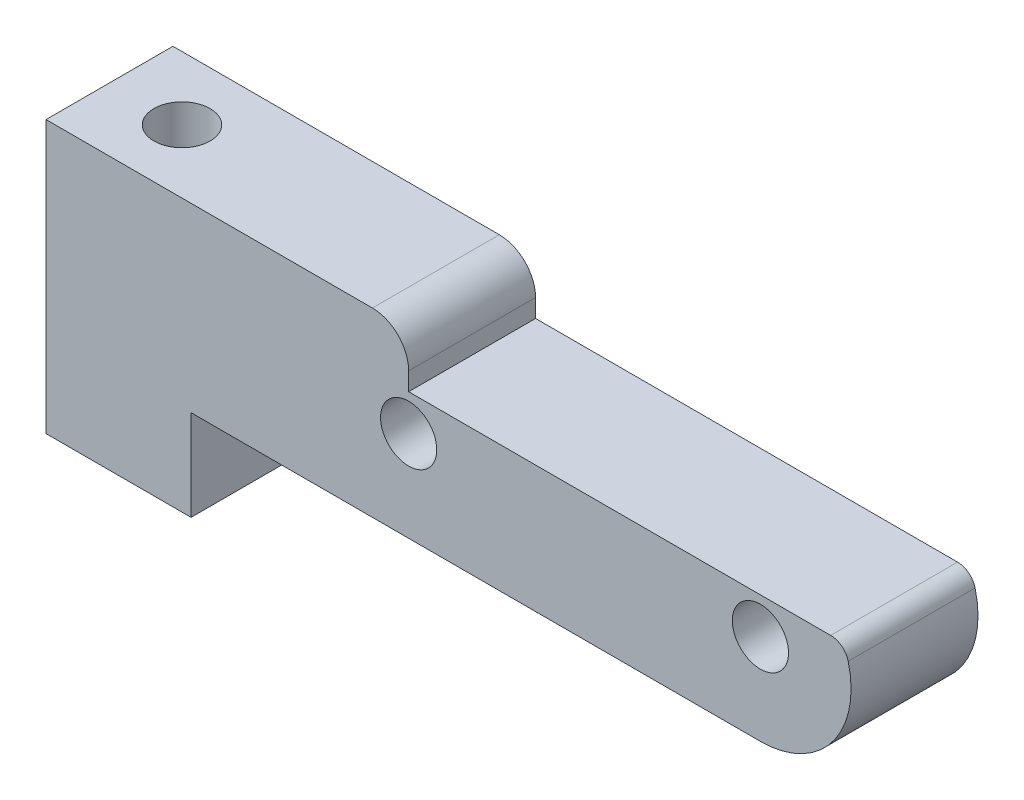
ISO-10303-21;
HEADER;
FILE_DESCRIPTION(('STEP AP214'),'2;1');
FILE_NAME('part.step','',(''),(''),'','','');
FILE_SCHEMA(('AUTOMOTIVE_DESIGN { 1 0 10303 214 1 1 1 1 }'));
ENDSEC;
DATA;
#1=APPLICATION_CONTEXT('core data for automotive mechanical design processes');
#2=APPLICATION_PROTOCOL_DEFINITION('international standard','automotive_design',2000,#1);
#3=PRODUCT_CONTEXT('',#1,'mechanical');
#4=PRODUCT('Part','Part','',(#3));
#5=PRODUCT_RELATED_PRODUCT_CATEGORY('part','',(#4));
#6=PRODUCT_DEFINITION_FORMATION('','',#4);
#7=PRODUCT_DEFINITION_CONTEXT('part definition',#1,'design');
#8=PRODUCT_DEFINITION('design','',#6,#7);
#9=PRODUCT_DEFINITION_SHAPE('','',#8);
#10=(LENGTH_UNIT() NAMED_UNIT(*) SI_UNIT(.MILLI.,.METRE.));
#11=(NAMED_UNIT(*) PLANE_ANGLE_UNIT() SI_UNIT($,.RADIAN.));
#12=(NAMED_UNIT(*) SI_UNIT($,.STERADIAN.) SOLID_ANGLE_UNIT());
#13=UNCERTAINTY_MEASURE_WITH_UNIT(LENGTH_MEASURE(1.E-05),#10,'distance_accuracy_value','');
#14=(GEOMETRIC_REPRESENTATION_CONTEXT(3) GLOBAL_UNCERTAINTY_ASSIGNED_CONTEXT((#13)) GLOBAL_UNIT_ASSIGNED_CONTEXT((#10,
#11,#12)) REPRESENTATION_CONTEXT('',''));
#15=CARTESIAN_POINT('',(0.,0.,0.));
#16=DIRECTION('',(0.,0.,1.));
#17=DIRECTION('',(1.,0.,0.));
#18=AXIS2_PLACEMENT_3D('',#15,#16,#17);
#19=CARTESIAN_POINT('',(0.,-5.,7.));
#20=DIRECTION('',(0.,-1.,0.));
#21=DIRECTION('',(1.,0.,0.));
#22=AXIS2_PLACEMENT_3D('',#19,#20,#21);
#23=PLANE('',#22);
#24=DIRECTION('',(-1.,0.,0.));
#25=VECTOR('',#24,1.);
#26=CARTESIAN_POINT('',(0.,-5.,7.));
#27=LINE('',#26,#25);
#28=CARTESIAN_POINT('',(9.7,-5.,7.));
#29=VERTEX_POINT('',#28);
#30=CARTESIAN_POINT('',(-21.7,-5.,7.));
#31=VERTEX_POINT('',#30);
#32=EDGE_CURVE('E177',#29,#31,#27,.T.);
#33=ORIENTED_EDGE('',*,*,#32,.T.);
#34=DIRECTION('',(0.,0.,1.));
#35=VECTOR('',#34,1.);
#36=CARTESIAN_POINT('',(-21.7,-5.,7.));
#37=LINE('',#36,#35);
#38=CARTESIAN_POINT('',(-21.7,-5.,0.));
#39=VERTEX_POINT('',#38);
#40=EDGE_CURVE('E147',#39,#31,#37,.T.);
#41=ORIENTED_EDGE('',*,*,#40,.F.);
#42=DIRECTION('',(-1.,0.,0.));
#43=VECTOR('',#42,1.);
#44=CARTESIAN_POINT('',(0.,-5.,0.));
#45=LINE('',#44,#43);
#46=CARTESIAN_POINT('',(9.7,-5.,0.));
#47=VERTEX_POINT('',#46);
#48=EDGE_CURVE('E206',#47,#39,#45,.T.);
#49=ORIENTED_EDGE('',*,*,#48,.F.);
#50=DIRECTION('',(0.,0.,-1.));
#51=VECTOR('',#50,1.);
#52=CARTESIAN_POINT('',(9.7,-5.,7.));
#53=LINE('',#52,#51);
#54=EDGE_CURVE('E192',#29,#47,#53,.T.);
#55=ORIENTED_EDGE('',*,*,#54,.F.);
#56=EDGE_LOOP('',(#33,#41,#49,#55));
#57=FACE_BOUND('',#56,.T.);
#58=ADVANCED_FACE('F47',(#57),#23,.T.);
#59=CARTESIAN_POINT('',(0.,2.,7.));
#60=DIRECTION('',(0.,1.,0.));
#61=DIRECTION('',(0.,0.,1.));
#62=AXIS2_PLACEMENT_3D('',#59,#60,#61);
#63=PLANE('',#62);
#64=DIRECTION('',(1.,0.,0.));
#65=VECTOR('',#64,1.);
#66=CARTESIAN_POINT('',(0.,2.,7.));
#67=LINE('',#66,#65);
#68=CARTESIAN_POINT('',(-9.7,2.,7.));
#69=VERTEX_POINT('',#68);
#70=CARTESIAN_POINT('',(13.5729833462074,2.,7.));
#71=VERTEX_POINT('',#70);
#72=EDGE_CURVE('E164',#69,#71,#67,.T.);
#73=ORIENTED_EDGE('',*,*,#72,.T.);
#74=DIRECTION('',(0.,0.,1.));
#75=VECTOR('',#74,1.);
#76=CARTESIAN_POINT('',(13.5729833462074,2.,0.));
#77=LINE('',#76,#75);
#78=CARTESIAN_POINT('',(13.5729833462074,2.,0.));
#79=VERTEX_POINT('',#78);
#80=EDGE_CURVE('E231',#71,#79,#77,.F.);
#81=ORIENTED_EDGE('',*,*,#80,.T.);
#82=DIRECTION('',(1.,0.,0.));
#83=VECTOR('',#82,1.);
#84=CARTESIAN_POINT('',(0.,2.,0.));
#85=LINE('',#84,#83);
#86=CARTESIAN_POINT('',(-9.7,2.,0.));
#87=VERTEX_POINT('',#86);
#88=EDGE_CURVE('E159',#87,#79,#85,.T.);
#89=ORIENTED_EDGE('',*,*,#88,.F.);
#90=DIRECTION('',(0.,0.,-1.));
#91=VECTOR('',#90,1.);
#92=CARTESIAN_POINT('',(-9.7,2.,7.));
#93=LINE('',#92,#91);
#94=EDGE_CURVE('E227',#69,#87,#93,.T.);
#95=ORIENTED_EDGE('',*,*,#94,.F.);
#96=EDGE_LOOP('',(#73,#81,#89,#95));
#97=FACE_BOUND('',#96,.T.);
#98=ADVANCED_FACE('F283',(#97),#63,.T.);
#99=CARTESIAN_POINT('',(-9.7,0.,7.));
#100=DIRECTION('',(1.,0.,0.));
#101=DIRECTION('',(0.,0.,-1.));
#102=AXIS2_PLACEMENT_3D('',#99,#100,#101);
#103=PLANE('',#102);
#104=DIRECTION('',(0.,-1.,0.));
#105=VECTOR('',#104,1.);
#106=CARTESIAN_POINT('',(-9.7,0.,0.));
#107=LINE('',#106,#105);
#108=CARTESIAN_POINT('',(-9.7,3.,0.));
#109=VERTEX_POINT('',#108);
#110=EDGE_CURVE('E196',#109,#87,#107,.T.);
#111=ORIENTED_EDGE('',*,*,#110,.F.);
#112=DIRECTION('',(0.,0.,-1.));
#113=VECTOR('',#112,1.);
#114=CARTESIAN_POINT('',(-9.7,3.,7.));
#115=LINE('',#114,#113);
#116=CARTESIAN_POINT('',(-9.7,3.,7.));
#117=VERTEX_POINT('',#116);
#118=EDGE_CURVE('E56',#109,#117,#115,.F.);
#119=ORIENTED_EDGE('',*,*,#118,.T.);
#120=DIRECTION('',(0.,-1.,0.));
#121=VECTOR('',#120,1.);
#122=CARTESIAN_POINT('',(-9.7,0.,7.));
#123=LINE('',#122,#121);
#124=EDGE_CURVE('E168',#117,#69,#123,.T.);
#125=ORIENTED_EDGE('',*,*,#124,.T.);
#126=ORIENTED_EDGE('',*,*,#94,.T.);
#127=EDGE_LOOP('',(#111,#119,#125,#126));
#128=FACE_BOUND('',#127,.T.);
#129=ADVANCED_FACE('F291',(#128),#103,.T.);
#130=CARTESIAN_POINT('',(0.,5.,7.));
#131=DIRECTION('',(0.,-1.,0.));
#132=DIRECTION('',(1.,0.,0.));
#133=AXIS2_PLACEMENT_3D('',#130,#131,#132);
#134=PLANE('',#133);
#135=CARTESIAN_POINT('',(-25.7,5.,3.5));
#136=DIRECTION('',(0.,1.,0.));
#137=DIRECTION('',(-1.,0.,0.));
#138=AXIS2_PLACEMENT_3D('',#135,#136,#137);
#139=CIRCLE('',#138,1.55);
#140=CARTESIAN_POINT('',(-27.25,5.,3.5));
#141=VERTEX_POINT('',#140);
#142=EDGE_CURVE('E153',#141,#141,#139,.T.);
#143=ORIENTED_EDGE('',*,*,#142,.F.);
#144=EDGE_LOOP('',(#143));
#145=FACE_BOUND('',#144,.T.);
#146=DIRECTION('',(-1.,0.,0.));
#147=VECTOR('',#146,1.);
#148=CARTESIAN_POINT('',(0.,5.,7.));
#149=LINE('',#148,#147);
#150=CARTESIAN_POINT('',(-11.7,5.,7.));
#151=VERTEX_POINT('',#150);
#152=CARTESIAN_POINT('',(-29.7,5.,7.));
#153=VERTEX_POINT('',#152);
#154=EDGE_CURVE('E172',#151,#153,#149,.T.);
#155=ORIENTED_EDGE('',*,*,#154,.F.);
#156=DIRECTION('',(0.,0.,-1.));
#157=VECTOR('',#156,1.);
#158=CARTESIAN_POINT('',(-11.7,5.,0.));
#159=LINE('',#158,#157);
#160=CARTESIAN_POINT('',(-11.7,5.,0.));
#161=VERTEX_POINT('',#160);
#162=EDGE_CURVE('E244',#151,#161,#159,.T.);
#163=ORIENTED_EDGE('',*,*,#162,.T.);
#164=DIRECTION('',(-1.,0.,0.));
#165=VECTOR('',#164,1.);
#166=CARTESIAN_POINT('',(0.,5.,0.));
#167=LINE('',#166,#165);
#168=CARTESIAN_POINT('',(-29.7,5.,0.));
#169=VERTEX_POINT('',#168);
#170=EDGE_CURVE('E199',#161,#169,#167,.T.);
#171=ORIENTED_EDGE('',*,*,#170,.T.);
#172=DIRECTION('',(0.,0.,-1.));
#173=VECTOR('',#172,1.);
#174=CARTESIAN_POINT('',(-29.7,5.,7.));
#175=LINE('',#174,#173);
#176=EDGE_CURVE('E223',#153,#169,#175,.T.);
#177=ORIENTED_EDGE('',*,*,#176,.F.);
#178=EDGE_LOOP('',(#155,#163,#171,#177));
#179=FACE_BOUND('',#178,.T.);
#180=ADVANCED_FACE('F253',(#145,#179),#134,.F.);
#181=CARTESIAN_POINT('',(-29.7,0.,7.));
#182=DIRECTION('',(-1.,0.,0.));
#183=DIRECTION('',(0.,0.,1.));
#184=AXIS2_PLACEMENT_3D('',#181,#182,#183);
#185=PLANE('',#184);
#186=DIRECTION('',(0.,1.,0.));
#187=VECTOR('',#186,1.);
#188=CARTESIAN_POINT('',(-29.7,0.,0.));
#189=LINE('',#188,#187);
#190=CARTESIAN_POINT('',(-29.7,-10.,0.));
#191=VERTEX_POINT('',#190);
#192=EDGE_CURVE('E202',#191,#169,#189,.T.);
#193=ORIENTED_EDGE('',*,*,#192,.F.);
#194=DIRECTION('',(0.,0.,-1.));
#195=VECTOR('',#194,1.);
#196=CARTESIAN_POINT('',(-29.7,-10.,7.));
#197=LINE('',#196,#195);
#198=CARTESIAN_POINT('',(-29.7,-10.,7.));
#199=VERTEX_POINT('',#198);
#200=EDGE_CURVE('E136',#199,#191,#197,.T.);
#201=ORIENTED_EDGE('',*,*,#200,.F.);
#202=DIRECTION('',(0.,1.,0.));
#203=VECTOR('',#202,1.);
#204=CARTESIAN_POINT('',(-29.7,0.,7.));
#205=LINE('',#204,#203);
#206=EDGE_CURVE('E131',#199,#153,#205,.T.);
#207=ORIENTED_EDGE('',*,*,#206,.T.);
#208=ORIENTED_EDGE('',*,*,#176,.T.);
#209=EDGE_LOOP('',(#193,#201,#207,#208));
#210=FACE_BOUND('',#209,.T.);
#211=ADVANCED_FACE('F260',(#210),#185,.T.);
#212=CARTESIAN_POINT('',(-9.7,0.,7.));
#213=DIRECTION('',(0.,0.,-1.));
#214=DIRECTION('',(-1.,0.,0.));
#215=AXIS2_PLACEMENT_3D('',#212,#213,#214);
#216=CYLINDRICAL_SURFACE('',#215,1.55);
#217=CARTESIAN_POINT('',(-9.7,0.,7.));
#218=DIRECTION('',(0.,0.,1.));
#219=DIRECTION('',(1.,0.,0.));
#220=AXIS2_PLACEMENT_3D('',#217,#218,#219);
#221=CIRCLE('',#220,1.55);
#222=CARTESIAN_POINT('',(-8.15,0.,7.));
#223=VERTEX_POINT('',#222);
#224=EDGE_CURVE('E184',#223,#223,#221,.T.);
#225=ORIENTED_EDGE('',*,*,#224,.T.);
#226=EDGE_LOOP('',(#225));
#227=FACE_BOUND('',#226,.T.);
#228=CARTESIAN_POINT('',(-9.7,0.,0.));
#229=DIRECTION('',(0.,0.,1.));
#230=DIRECTION('',(1.,0.,0.));
#231=AXIS2_PLACEMENT_3D('',#228,#229,#230);
#232=CIRCLE('',#231,1.55);
#233=CARTESIAN_POINT('',(-8.15,0.,0.));
#234=VERTEX_POINT('',#233);
#235=EDGE_CURVE('E214',#234,#234,#232,.T.);
#236=ORIENTED_EDGE('',*,*,#235,.F.);
#237=EDGE_LOOP('',(#236));
#238=FACE_BOUND('',#237,.T.);
#239=ADVANCED_FACE('F299',(#227,#238),#216,.F.);
#240=CARTESIAN_POINT('',(9.7,0.,7.));
#241=DIRECTION('',(0.,0.,-1.));
#242=DIRECTION('',(-1.,0.,0.));
#243=AXIS2_PLACEMENT_3D('',#240,#241,#242);
#244=CYLINDRICAL_SURFACE('',#243,5.);
#245=CARTESIAN_POINT('',(9.7,0.,0.));
#246=DIRECTION('',(0.,0.,1.));
#247=DIRECTION('',(1.,0.,0.));
#248=AXIS2_PLACEMENT_3D('',#245,#246,#247);
#249=CIRCLE('',#248,5.);
#250=CARTESIAN_POINT('',(14.5412291827593,1.25,0.));
#251=VERTEX_POINT('',#250);
#252=EDGE_CURVE('E210',#47,#251,#249,.T.);
#253=ORIENTED_EDGE('',*,*,#252,.T.);
#254=DIRECTION('',(0.,0.,-1.));
#255=VECTOR('',#254,1.);
#256=CARTESIAN_POINT('',(14.5412291827593,1.25,7.));
#257=LINE('',#256,#255);
#258=CARTESIAN_POINT('',(14.5412291827593,1.25,7.));
#259=VERTEX_POINT('',#258);
#260=EDGE_CURVE('E238',#251,#259,#257,.F.);
#261=ORIENTED_EDGE('',*,*,#260,.T.);
#262=CARTESIAN_POINT('',(9.7,0.,7.));
#263=DIRECTION('',(0.,0.,1.));
#264=DIRECTION('',(1.,0.,0.));
#265=AXIS2_PLACEMENT_3D('',#262,#263,#264);
#266=CIRCLE('',#265,5.);
#267=EDGE_CURVE('E180',#29,#259,#266,.T.);
#268=ORIENTED_EDGE('',*,*,#267,.F.);
#269=ORIENTED_EDGE('',*,*,#54,.T.);
#270=EDGE_LOOP('',(#253,#261,#268,#269));
#271=FACE_BOUND('',#270,.T.);
#272=ADVANCED_FACE('F296',(#271),#244,.T.);
#273=CARTESIAN_POINT('',(9.7,0.,7.));
#274=DIRECTION('',(0.,0.,-1.));
#275=DIRECTION('',(-1.,0.,0.));
#276=AXIS2_PLACEMENT_3D('',#273,#274,#275);
#277=CYLINDRICAL_SURFACE('',#276,1.55);
#278=CARTESIAN_POINT('',(9.7,0.,7.));
#279=DIRECTION('',(0.,0.,1.));
#280=DIRECTION('',(1.,0.,0.));
#281=AXIS2_PLACEMENT_3D('',#278,#279,#280);
#282=CIRCLE('',#281,1.55);
#283=CARTESIAN_POINT('',(11.25,0.,7.));
#284=VERTEX_POINT('',#283);
#285=EDGE_CURVE('E188',#284,#284,#282,.T.);
#286=ORIENTED_EDGE('',*,*,#285,.T.);
#287=EDGE_LOOP('',(#286));
#288=FACE_BOUND('',#287,.T.);
#289=CARTESIAN_POINT('',(9.7,0.,0.));
#290=DIRECTION('',(0.,0.,1.));
#291=DIRECTION('',(1.,0.,0.));
#292=AXIS2_PLACEMENT_3D('',#289,#290,#291);
#293=CIRCLE('',#292,1.55);
#294=CARTESIAN_POINT('',(11.25,0.,0.));
#295=VERTEX_POINT('',#294);
#296=EDGE_CURVE('E169',#295,#295,#293,.T.);
#297=ORIENTED_EDGE('',*,*,#296,.F.);
#298=EDGE_LOOP('',(#297));
#299=FACE_BOUND('',#298,.T.);
#300=ADVANCED_FACE('F322',(#288,#299),#277,.F.);
#301=CARTESIAN_POINT('',(0.,0.,7.));
#302=DIRECTION('',(0.,0.,1.));
#303=DIRECTION('',(1.,0.,0.));
#304=AXIS2_PLACEMENT_3D('',#301,#302,#303);
#305=PLANE('',#304);
#306=ORIENTED_EDGE('',*,*,#124,.F.);
#307=CARTESIAN_POINT('',(-11.7,3.,7.));
#308=DIRECTION('',(0.,0.,1.));
#309=DIRECTION('',(1.,0.,0.));
#310=AXIS2_PLACEMENT_3D('',#307,#308,#309);
#311=CIRCLE('',#310,2.);
#312=EDGE_CURVE('E11',#117,#151,#311,.T.);
#313=ORIENTED_EDGE('',*,*,#312,.T.);
#314=ORIENTED_EDGE('',*,*,#154,.T.);
#315=ORIENTED_EDGE('',*,*,#206,.F.);
#316=DIRECTION('',(-1.,0.,0.));
#317=VECTOR('',#316,1.);
#318=CARTESIAN_POINT('',(-29.7,-10.,7.));
#319=LINE('',#318,#317);
#320=CARTESIAN_POINT('',(-21.7,-10.,7.));
#321=VERTEX_POINT('',#320);
#322=EDGE_CURVE('E122',#321,#199,#319,.T.);
#323=ORIENTED_EDGE('',*,*,#322,.F.);
#324=DIRECTION('',(0.,1.,0.));
#325=VECTOR('',#324,1.);
#326=CARTESIAN_POINT('',(-21.7,-10.,7.));
#327=LINE('',#326,#325);
#328=EDGE_CURVE('E128',#321,#31,#327,.T.);
#329=ORIENTED_EDGE('',*,*,#328,.T.);
#330=ORIENTED_EDGE('',*,*,#32,.F.);
#331=ORIENTED_EDGE('',*,*,#267,.T.);
#332=CARTESIAN_POINT('',(13.5729833462074,1.,7.));
#333=DIRECTION('',(0.,0.,1.));
#334=DIRECTION('',(1.,0.,0.));
#335=AXIS2_PLACEMENT_3D('',#332,#333,#334);
#336=CIRCLE('',#335,1.);
#337=EDGE_CURVE('E241',#259,#71,#336,.T.);
#338=ORIENTED_EDGE('',*,*,#337,.T.);
#339=ORIENTED_EDGE('',*,*,#72,.F.);
#340=EDGE_LOOP('',(#306,#313,#314,#315,#323,#329,#330,#331,#338,#339));
#341=FACE_BOUND('',#340,.T.);
#342=ORIENTED_EDGE('',*,*,#224,.F.);
#343=EDGE_LOOP('',(#342));
#344=FACE_BOUND('',#343,.T.);
#345=ORIENTED_EDGE('',*,*,#285,.F.);
#346=EDGE_LOOP('',(#345));
#347=FACE_BOUND('',#346,.T.);
#348=ADVANCED_FACE('F124',(#341,#344,#347),#305,.T.);
#349=CARTESIAN_POINT('',(0.,0.,0.));
#350=DIRECTION('',(0.,0.,1.));
#351=DIRECTION('',(1.,0.,0.));
#352=AXIS2_PLACEMENT_3D('',#349,#350,#351);
#353=PLANE('',#352);
#354=ORIENTED_EDGE('',*,*,#170,.F.);
#355=CARTESIAN_POINT('',(-11.7,3.,0.));
#356=DIRECTION('',(0.,0.,1.));
#357=DIRECTION('',(1.,0.,0.));
#358=AXIS2_PLACEMENT_3D('',#355,#356,#357);
#359=CIRCLE('',#358,2.);
#360=EDGE_CURVE('E70',#161,#109,#359,.F.);
#361=ORIENTED_EDGE('',*,*,#360,.T.);
#362=ORIENTED_EDGE('',*,*,#110,.T.);
#363=ORIENTED_EDGE('',*,*,#88,.T.);
#364=CARTESIAN_POINT('',(13.5729833462074,1.,0.));
#365=DIRECTION('',(0.,0.,1.));
#366=DIRECTION('',(1.,0.,0.));
#367=AXIS2_PLACEMENT_3D('',#364,#365,#366);
#368=CIRCLE('',#367,1.);
#369=EDGE_CURVE('E235',#79,#251,#368,.F.);
#370=ORIENTED_EDGE('',*,*,#369,.T.);
#371=ORIENTED_EDGE('',*,*,#252,.F.);
#372=ORIENTED_EDGE('',*,*,#48,.T.);
#373=DIRECTION('',(0.,1.,0.));
#374=VECTOR('',#373,1.);
#375=CARTESIAN_POINT('',(-21.7,-10.,0.));
#376=LINE('',#375,#374);
#377=CARTESIAN_POINT('',(-21.7,-10.,0.));
#378=VERTEX_POINT('',#377);
#379=EDGE_CURVE('E154',#378,#39,#376,.T.);
#380=ORIENTED_EDGE('',*,*,#379,.F.);
#381=DIRECTION('',(1.,0.,0.));
#382=VECTOR('',#381,1.);
#383=CARTESIAN_POINT('',(-29.7,-10.,0.));
#384=LINE('',#383,#382);
#385=EDGE_CURVE('E143',#191,#378,#384,.T.);
#386=ORIENTED_EDGE('',*,*,#385,.F.);
#387=ORIENTED_EDGE('',*,*,#192,.T.);
#388=EDGE_LOOP('',(#354,#361,#362,#363,#370,#371,#372,#380,#386,#387));
#389=FACE_BOUND('',#388,.T.);
#390=ORIENTED_EDGE('',*,*,#235,.T.);
#391=EDGE_LOOP('',(#390));
#392=FACE_BOUND('',#391,.T.);
#393=ORIENTED_EDGE('',*,*,#296,.T.);
#394=EDGE_LOOP('',(#393));
#395=FACE_BOUND('',#394,.T.);
#396=ADVANCED_FACE('F257',(#389,#392,#395),#353,.F.);
#397=CARTESIAN_POINT('',(13.5729833462074,1.,7.));
#398=DIRECTION('',(0.,0.,-1.));
#399=DIRECTION('',(-1.,0.,0.));
#400=AXIS2_PLACEMENT_3D('',#397,#398,#399);
#401=CYLINDRICAL_SURFACE('',#400,1.);
#402=ORIENTED_EDGE('',*,*,#337,.F.);
#403=ORIENTED_EDGE('',*,*,#260,.F.);
#404=ORIENTED_EDGE('',*,*,#369,.F.);
#405=ORIENTED_EDGE('',*,*,#80,.F.);
#406=EDGE_LOOP('',(#402,#403,#404,#405));
#407=FACE_BOUND('',#406,.T.);
#408=ADVANCED_FACE('F303',(#407),#401,.T.);
#409=CARTESIAN_POINT('',(-11.7,3.,7.));
#410=DIRECTION('',(0.,0.,1.));
#411=DIRECTION('',(1.,0.,0.));
#412=AXIS2_PLACEMENT_3D('',#409,#410,#411);
#413=CYLINDRICAL_SURFACE('',#412,2.);
#414=ORIENTED_EDGE('',*,*,#312,.F.);
#415=ORIENTED_EDGE('',*,*,#118,.F.);
#416=ORIENTED_EDGE('',*,*,#360,.F.);
#417=ORIENTED_EDGE('',*,*,#162,.F.);
#418=EDGE_LOOP('',(#414,#415,#416,#417));
#419=FACE_BOUND('',#418,.T.);
#420=ADVANCED_FACE('F49',(#419),#413,.T.);
#421=CARTESIAN_POINT('',(-25.7,-5.,3.5));
#422=DIRECTION('',(0.,1.,0.));
#423=DIRECTION('',(-1.,0.,0.));
#424=AXIS2_PLACEMENT_3D('',#421,#422,#423);
#425=CYLINDRICAL_SURFACE('',#424,1.55);
#426=ORIENTED_EDGE('',*,*,#142,.T.);
#427=EDGE_LOOP('',(#426));
#428=FACE_BOUND('',#427,.T.);
#429=CARTESIAN_POINT('',(-25.7,-10.,3.5));
#430=DIRECTION('',(0.,-1.,0.));
#431=DIRECTION('',(1.,0.,0.));
#432=AXIS2_PLACEMENT_3D('',#429,#430,#431);
#433=CIRCLE('',#432,1.55);
#434=CARTESIAN_POINT('',(-24.15,-10.,3.5));
#435=VERTEX_POINT('',#434);
#436=EDGE_CURVE('E266',#435,#435,#433,.T.);
#437=ORIENTED_EDGE('',*,*,#436,.T.);
#438=EDGE_LOOP('',(#437));
#439=FACE_BOUND('',#438,.T.);
#440=ADVANCED_FACE('F272',(#428,#439),#425,.F.);
#441=CARTESIAN_POINT('',(0.,-10.,0.));
#442=DIRECTION('',(0.,-1.,0.));
#443=DIRECTION('',(0.,0.,-1.));
#444=AXIS2_PLACEMENT_3D('',#441,#442,#443);
#445=PLANE('',#444);
#446=DIRECTION('',(0.,0.,1.));
#447=VECTOR('',#446,1.);
#448=CARTESIAN_POINT('',(-21.7,-10.,7.));
#449=LINE('',#448,#447);
#450=EDGE_CURVE('E137',#378,#321,#449,.T.);
#451=ORIENTED_EDGE('',*,*,#450,.T.);
#452=ORIENTED_EDGE('',*,*,#322,.T.);
#453=ORIENTED_EDGE('',*,*,#200,.T.);
#454=ORIENTED_EDGE('',*,*,#385,.T.);
#455=EDGE_LOOP('',(#451,#452,#453,#454));
#456=FACE_BOUND('',#455,.T.);
#457=ORIENTED_EDGE('',*,*,#436,.F.);
#458=EDGE_LOOP('',(#457));
#459=FACE_BOUND('',#458,.T.);
#460=ADVANCED_FACE('F140',(#456,#459),#445,.T.);
#461=CARTESIAN_POINT('',(-21.7,-10.,7.));
#462=DIRECTION('',(-1.,0.,0.));
#463=DIRECTION('',(0.,-1.,0.));
#464=AXIS2_PLACEMENT_3D('',#461,#462,#463);
#465=PLANE('',#464);
#466=ORIENTED_EDGE('',*,*,#40,.T.);
#467=ORIENTED_EDGE('',*,*,#328,.F.);
#468=ORIENTED_EDGE('',*,*,#450,.F.);
#469=ORIENTED_EDGE('',*,*,#379,.T.);
#470=EDGE_LOOP('',(#466,#467,#468,#469));
#471=FACE_BOUND('',#470,.T.);
#472=ADVANCED_FACE('F149',(#471),#465,.F.);
#473=CLOSED_SHELL('',(#58,#98,#129,#180,#211,#239,#272,#300,#348,#396,#408,#420,#440,#460,#472));
#474=MANIFOLD_SOLID_BREP('B2',#473);
#475=ADVANCED_BREP_SHAPE_REPRESENTATION('',(#18,#474),#14);
#476=SHAPE_DEFINITION_REPRESENTATION(#9,#475);
ENDSEC;
END-ISO-10303-21;
